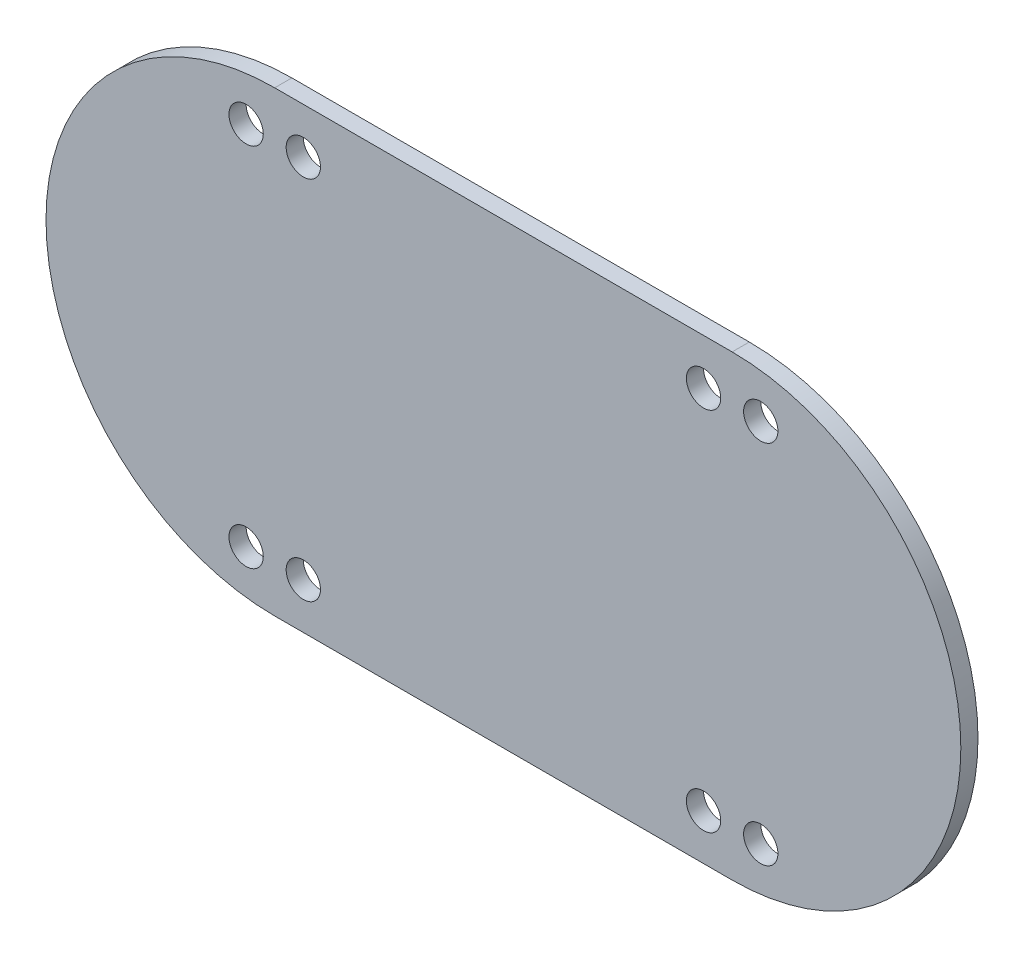
ISO-10303-21;
HEADER;
FILE_DESCRIPTION(('STEP AP214'),'2;1');
FILE_NAME('part.step','',(''),(''),'','','');
FILE_SCHEMA(('AUTOMOTIVE_DESIGN { 1 0 10303 214 1 1 1 1 }'));
ENDSEC;
DATA;
#1=APPLICATION_CONTEXT('core data for automotive mechanical design processes');
#2=APPLICATION_PROTOCOL_DEFINITION('international standard','automotive_design',2000,#1);
#3=PRODUCT_CONTEXT('',#1,'mechanical');
#4=PRODUCT('Part','Part','',(#3));
#5=PRODUCT_RELATED_PRODUCT_CATEGORY('part','',(#4));
#6=PRODUCT_DEFINITION_FORMATION('','',#4);
#7=PRODUCT_DEFINITION_CONTEXT('part definition',#1,'design');
#8=PRODUCT_DEFINITION('design','',#6,#7);
#9=PRODUCT_DEFINITION_SHAPE('','',#8);
#10=(LENGTH_UNIT() NAMED_UNIT(*) SI_UNIT(.MILLI.,.METRE.));
#11=(NAMED_UNIT(*) PLANE_ANGLE_UNIT() SI_UNIT($,.RADIAN.));
#12=(NAMED_UNIT(*) SI_UNIT($,.STERADIAN.) SOLID_ANGLE_UNIT());
#13=UNCERTAINTY_MEASURE_WITH_UNIT(LENGTH_MEASURE(1.E-05),#10,'distance_accuracy_value','');
#14=(GEOMETRIC_REPRESENTATION_CONTEXT(3) GLOBAL_UNCERTAINTY_ASSIGNED_CONTEXT((#13)) GLOBAL_UNIT_ASSIGNED_CONTEXT((#10,
#11,#12)) REPRESENTATION_CONTEXT('',''));
#15=CARTESIAN_POINT('',(0.,0.,0.));
#16=DIRECTION('',(0.,0.,1.));
#17=DIRECTION('',(1.,0.,0.));
#18=AXIS2_PLACEMENT_3D('',#15,#16,#17);
#19=CARTESIAN_POINT('',(-40.,0.219178082191764,3.));
#20=DIRECTION('',(0.,0.,1.));
#21=DIRECTION('',(1.,0.,0.));
#22=AXIS2_PLACEMENT_3D('',#19,#20,#21);
#23=PLANE('',#22);
#24=CARTESIAN_POINT('',(-35.,-31.7808219178082,3.));
#25=DIRECTION('',(0.,0.,1.));
#26=DIRECTION('',(1.,0.,0.));
#27=AXIS2_PLACEMENT_3D('',#24,#25,#26);
#28=CIRCLE('',#27,3.);
#29=CARTESIAN_POINT('',(-32.,-31.7808219178082,3.));
#30=VERTEX_POINT('',#29);
#31=EDGE_CURVE('E147',#30,#30,#28,.T.);
#32=ORIENTED_EDGE('',*,*,#31,.F.);
#33=EDGE_LOOP('',(#32));
#34=FACE_BOUND('',#33,.T.);
#35=CARTESIAN_POINT('',(35.,32.2191780821918,3.));
#36=DIRECTION('',(0.,0.,1.));
#37=DIRECTION('',(1.,0.,0.));
#38=AXIS2_PLACEMENT_3D('',#35,#36,#37);
#39=CIRCLE('',#38,3.);
#40=CARTESIAN_POINT('',(38.,32.2191780821918,3.));
#41=VERTEX_POINT('',#40);
#42=EDGE_CURVE('E135',#41,#41,#39,.T.);
#43=ORIENTED_EDGE('',*,*,#42,.F.);
#44=EDGE_LOOP('',(#43));
#45=FACE_BOUND('',#44,.T.);
#46=CARTESIAN_POINT('',(-45.,32.2191780821918,3.));
#47=DIRECTION('',(0.,0.,1.));
#48=DIRECTION('',(1.,0.,0.));
#49=AXIS2_PLACEMENT_3D('',#46,#47,#48);
#50=CIRCLE('',#49,3.);
#51=CARTESIAN_POINT('',(-42.,32.2191780821918,3.));
#52=VERTEX_POINT('',#51);
#53=EDGE_CURVE('E123',#52,#52,#50,.T.);
#54=ORIENTED_EDGE('',*,*,#53,.F.);
#55=EDGE_LOOP('',(#54));
#56=FACE_BOUND('',#55,.T.);
#57=CARTESIAN_POINT('',(45.,32.2191780821918,3.));
#58=DIRECTION('',(0.,0.,1.));
#59=DIRECTION('',(1.,0.,0.));
#60=AXIS2_PLACEMENT_3D('',#57,#58,#59);
#61=CIRCLE('',#60,3.);
#62=CARTESIAN_POINT('',(48.,32.2191780821918,3.));
#63=VERTEX_POINT('',#62);
#64=EDGE_CURVE('E102',#63,#63,#61,.T.);
#65=ORIENTED_EDGE('',*,*,#64,.F.);
#66=EDGE_LOOP('',(#65));
#67=FACE_BOUND('',#66,.T.);
#68=CARTESIAN_POINT('',(-40.,0.219178082191764,3.));
#69=DIRECTION('',(0.,0.,1.));
#70=DIRECTION('',(1.,0.,0.));
#71=AXIS2_PLACEMENT_3D('',#68,#69,#70);
#72=CIRCLE('',#71,40.);
#73=CARTESIAN_POINT('',(-40.0000000000001,40.2191780821917,3.));
#74=VERTEX_POINT('',#73);
#75=CARTESIAN_POINT('',(-40.,-39.7808219178082,3.));
#76=VERTEX_POINT('',#75);
#77=EDGE_CURVE('E87',#74,#76,#72,.T.);
#78=ORIENTED_EDGE('',*,*,#77,.T.);
#79=DIRECTION('',(1.,0.,0.));
#80=VECTOR('',#79,1.);
#81=CARTESIAN_POINT('',(40.,-39.7808219178082,3.));
#82=LINE('',#81,#80);
#83=CARTESIAN_POINT('',(40.,-39.7808219178082,3.));
#84=VERTEX_POINT('',#83);
#85=EDGE_CURVE('E82',#76,#84,#82,.T.);
#86=ORIENTED_EDGE('',*,*,#85,.T.);
#87=CARTESIAN_POINT('',(40.,0.219178082191789,3.));
#88=DIRECTION('',(0.,0.,1.));
#89=DIRECTION('',(1.,0.,0.));
#90=AXIS2_PLACEMENT_3D('',#87,#88,#89);
#91=CIRCLE('',#90,40.);
#92=CARTESIAN_POINT('',(39.9999999999999,40.2191780821918,3.));
#93=VERTEX_POINT('',#92);
#94=EDGE_CURVE('E85',#84,#93,#91,.T.);
#95=ORIENTED_EDGE('',*,*,#94,.T.);
#96=DIRECTION('',(-1.,0.,0.));
#97=VECTOR('',#96,1.);
#98=CARTESIAN_POINT('',(39.9999999999999,40.2191780821918,3.));
#99=LINE('',#98,#97);
#100=EDGE_CURVE('E52',#93,#74,#99,.T.);
#101=ORIENTED_EDGE('',*,*,#100,.T.);
#102=EDGE_LOOP('',(#78,#86,#95,#101));
#103=FACE_BOUND('',#102,.T.);
#104=CARTESIAN_POINT('',(45.,-31.7808219178082,3.));
#105=DIRECTION('',(0.,0.,1.));
#106=DIRECTION('',(1.,0.,0.));
#107=AXIS2_PLACEMENT_3D('',#104,#105,#106);
#108=CIRCLE('',#107,3.);
#109=CARTESIAN_POINT('',(48.,-31.7808219178082,3.));
#110=VERTEX_POINT('',#109);
#111=EDGE_CURVE('E117',#110,#110,#108,.T.);
#112=ORIENTED_EDGE('',*,*,#111,.F.);
#113=EDGE_LOOP('',(#112));
#114=FACE_BOUND('',#113,.T.);
#115=CARTESIAN_POINT('',(-45.,-31.7808219178082,3.));
#116=DIRECTION('',(0.,0.,1.));
#117=DIRECTION('',(1.,0.,0.));
#118=AXIS2_PLACEMENT_3D('',#115,#116,#117);
#119=CIRCLE('',#118,3.);
#120=CARTESIAN_POINT('',(-42.,-31.7808219178082,3.));
#121=VERTEX_POINT('',#120);
#122=EDGE_CURVE('E129',#121,#121,#119,.T.);
#123=ORIENTED_EDGE('',*,*,#122,.F.);
#124=EDGE_LOOP('',(#123));
#125=FACE_BOUND('',#124,.T.);
#126=CARTESIAN_POINT('',(-35.,32.2191780821918,3.));
#127=DIRECTION('',(0.,0.,1.));
#128=DIRECTION('',(1.,0.,0.));
#129=AXIS2_PLACEMENT_3D('',#126,#127,#128);
#130=CIRCLE('',#129,3.);
#131=CARTESIAN_POINT('',(-32.,32.2191780821918,3.));
#132=VERTEX_POINT('',#131);
#133=EDGE_CURVE('E141',#132,#132,#130,.T.);
#134=ORIENTED_EDGE('',*,*,#133,.F.);
#135=EDGE_LOOP('',(#134));
#136=FACE_BOUND('',#135,.T.);
#137=CARTESIAN_POINT('',(35.,-31.7808219178082,3.));
#138=DIRECTION('',(0.,0.,1.));
#139=DIRECTION('',(1.,0.,0.));
#140=AXIS2_PLACEMENT_3D('',#137,#138,#139);
#141=CIRCLE('',#140,3.);
#142=CARTESIAN_POINT('',(38.,-31.7808219178082,3.));
#143=VERTEX_POINT('',#142);
#144=EDGE_CURVE('E153',#143,#143,#141,.T.);
#145=ORIENTED_EDGE('',*,*,#144,.F.);
#146=EDGE_LOOP('',(#145));
#147=FACE_BOUND('',#146,.T.);
#148=ADVANCED_FACE('F35',(#34,#45,#56,#67,#103,#114,#125,#136,#147),#23,.T.);
#149=CARTESIAN_POINT('',(-40.,0.219178082191764,0.));
#150=DIRECTION('',(0.,0.,1.));
#151=DIRECTION('',(1.,0.,0.));
#152=AXIS2_PLACEMENT_3D('',#149,#150,#151);
#153=PLANE('',#152);
#154=CARTESIAN_POINT('',(-40.,0.219178082191764,0.));
#155=DIRECTION('',(0.,0.,1.));
#156=DIRECTION('',(1.,0.,0.));
#157=AXIS2_PLACEMENT_3D('',#154,#155,#156);
#158=CIRCLE('',#157,40.);
#159=CARTESIAN_POINT('',(-40.0000000000001,40.2191780821917,0.));
#160=VERTEX_POINT('',#159);
#161=CARTESIAN_POINT('',(-40.,-39.7808219178082,0.));
#162=VERTEX_POINT('',#161);
#163=EDGE_CURVE('E99',#160,#162,#158,.T.);
#164=ORIENTED_EDGE('',*,*,#163,.F.);
#165=DIRECTION('',(-1.,0.,0.));
#166=VECTOR('',#165,1.);
#167=CARTESIAN_POINT('',(39.9999999999999,40.2191780821918,0.));
#168=LINE('',#167,#166);
#169=CARTESIAN_POINT('',(39.9999999999999,40.2191780821918,0.));
#170=VERTEX_POINT('',#169);
#171=EDGE_CURVE('E75',#170,#160,#168,.T.);
#172=ORIENTED_EDGE('',*,*,#171,.F.);
#173=CARTESIAN_POINT('',(40.,0.219178082191789,0.));
#174=DIRECTION('',(0.,0.,1.));
#175=DIRECTION('',(1.,0.,0.));
#176=AXIS2_PLACEMENT_3D('',#173,#174,#175);
#177=CIRCLE('',#176,40.);
#178=CARTESIAN_POINT('',(40.,-39.7808219178082,0.));
#179=VERTEX_POINT('',#178);
#180=EDGE_CURVE('E69',#179,#170,#177,.T.);
#181=ORIENTED_EDGE('',*,*,#180,.F.);
#182=DIRECTION('',(1.,0.,0.));
#183=VECTOR('',#182,1.);
#184=CARTESIAN_POINT('',(40.,-39.7808219178082,0.));
#185=LINE('',#184,#183);
#186=EDGE_CURVE('E91',#162,#179,#185,.T.);
#187=ORIENTED_EDGE('',*,*,#186,.F.);
#188=EDGE_LOOP('',(#164,#172,#181,#187));
#189=FACE_BOUND('',#188,.T.);
#190=CARTESIAN_POINT('',(45.,32.2191780821918,0.));
#191=DIRECTION('',(0.,0.,1.));
#192=DIRECTION('',(1.,0.,0.));
#193=AXIS2_PLACEMENT_3D('',#190,#191,#192);
#194=CIRCLE('',#193,3.);
#195=CARTESIAN_POINT('',(48.,32.2191780821918,0.));
#196=VERTEX_POINT('',#195);
#197=EDGE_CURVE('E114',#196,#196,#194,.T.);
#198=ORIENTED_EDGE('',*,*,#197,.T.);
#199=EDGE_LOOP('',(#198));
#200=FACE_BOUND('',#199,.T.);
#201=CARTESIAN_POINT('',(45.,-31.7808219178082,0.));
#202=DIRECTION('',(0.,0.,1.));
#203=DIRECTION('',(1.,0.,0.));
#204=AXIS2_PLACEMENT_3D('',#201,#202,#203);
#205=CIRCLE('',#204,3.);
#206=CARTESIAN_POINT('',(48.,-31.7808219178082,0.));
#207=VERTEX_POINT('',#206);
#208=EDGE_CURVE('E120',#207,#207,#205,.T.);
#209=ORIENTED_EDGE('',*,*,#208,.T.);
#210=EDGE_LOOP('',(#209));
#211=FACE_BOUND('',#210,.T.);
#212=CARTESIAN_POINT('',(-45.,32.2191780821918,0.));
#213=DIRECTION('',(0.,0.,1.));
#214=DIRECTION('',(1.,0.,0.));
#215=AXIS2_PLACEMENT_3D('',#212,#213,#214);
#216=CIRCLE('',#215,3.);
#217=CARTESIAN_POINT('',(-42.,32.2191780821918,0.));
#218=VERTEX_POINT('',#217);
#219=EDGE_CURVE('E126',#218,#218,#216,.T.);
#220=ORIENTED_EDGE('',*,*,#219,.T.);
#221=EDGE_LOOP('',(#220));
#222=FACE_BOUND('',#221,.T.);
#223=CARTESIAN_POINT('',(-45.,-31.7808219178082,0.));
#224=DIRECTION('',(0.,0.,1.));
#225=DIRECTION('',(1.,0.,0.));
#226=AXIS2_PLACEMENT_3D('',#223,#224,#225);
#227=CIRCLE('',#226,3.);
#228=CARTESIAN_POINT('',(-42.,-31.7808219178082,0.));
#229=VERTEX_POINT('',#228);
#230=EDGE_CURVE('E132',#229,#229,#227,.T.);
#231=ORIENTED_EDGE('',*,*,#230,.T.);
#232=EDGE_LOOP('',(#231));
#233=FACE_BOUND('',#232,.T.);
#234=CARTESIAN_POINT('',(35.,32.2191780821918,0.));
#235=DIRECTION('',(0.,0.,1.));
#236=DIRECTION('',(1.,0.,0.));
#237=AXIS2_PLACEMENT_3D('',#234,#235,#236);
#238=CIRCLE('',#237,3.);
#239=CARTESIAN_POINT('',(38.,32.2191780821918,0.));
#240=VERTEX_POINT('',#239);
#241=EDGE_CURVE('E138',#240,#240,#238,.T.);
#242=ORIENTED_EDGE('',*,*,#241,.T.);
#243=EDGE_LOOP('',(#242));
#244=FACE_BOUND('',#243,.T.);
#245=CARTESIAN_POINT('',(-35.,32.2191780821918,0.));
#246=DIRECTION('',(0.,0.,1.));
#247=DIRECTION('',(1.,0.,0.));
#248=AXIS2_PLACEMENT_3D('',#245,#246,#247);
#249=CIRCLE('',#248,3.);
#250=CARTESIAN_POINT('',(-32.,32.2191780821918,0.));
#251=VERTEX_POINT('',#250);
#252=EDGE_CURVE('E144',#251,#251,#249,.T.);
#253=ORIENTED_EDGE('',*,*,#252,.T.);
#254=EDGE_LOOP('',(#253));
#255=FACE_BOUND('',#254,.T.);
#256=CARTESIAN_POINT('',(-35.,-31.7808219178082,0.));
#257=DIRECTION('',(0.,0.,1.));
#258=DIRECTION('',(1.,0.,0.));
#259=AXIS2_PLACEMENT_3D('',#256,#257,#258);
#260=CIRCLE('',#259,3.);
#261=CARTESIAN_POINT('',(-32.,-31.7808219178082,0.));
#262=VERTEX_POINT('',#261);
#263=EDGE_CURVE('E150',#262,#262,#260,.T.);
#264=ORIENTED_EDGE('',*,*,#263,.T.);
#265=EDGE_LOOP('',(#264));
#266=FACE_BOUND('',#265,.T.);
#267=CARTESIAN_POINT('',(35.,-31.7808219178082,0.));
#268=DIRECTION('',(0.,0.,1.));
#269=DIRECTION('',(1.,0.,0.));
#270=AXIS2_PLACEMENT_3D('',#267,#268,#269);
#271=CIRCLE('',#270,3.);
#272=CARTESIAN_POINT('',(38.,-31.7808219178082,0.));
#273=VERTEX_POINT('',#272);
#274=EDGE_CURVE('E156',#273,#273,#271,.T.);
#275=ORIENTED_EDGE('',*,*,#274,.T.);
#276=EDGE_LOOP('',(#275));
#277=FACE_BOUND('',#276,.T.);
#278=ADVANCED_FACE('F110',(#189,#200,#211,#222,#233,#244,#255,#266,#277),#153,.F.);
#279=CARTESIAN_POINT('',(-40.,0.219178082191764,3.));
#280=DIRECTION('',(0.,0.,-1.));
#281=DIRECTION('',(-1.,0.,0.));
#282=AXIS2_PLACEMENT_3D('',#279,#280,#281);
#283=CYLINDRICAL_SURFACE('',#282,40.);
#284=ORIENTED_EDGE('',*,*,#163,.T.);
#285=DIRECTION('',(0.,0.,-1.));
#286=VECTOR('',#285,1.);
#287=CARTESIAN_POINT('',(-40.,-39.7808219178082,3.));
#288=LINE('',#287,#286);
#289=EDGE_CURVE('E11',#76,#162,#288,.T.);
#290=ORIENTED_EDGE('',*,*,#289,.F.);
#291=ORIENTED_EDGE('',*,*,#77,.F.);
#292=DIRECTION('',(0.,0.,-1.));
#293=VECTOR('',#292,1.);
#294=CARTESIAN_POINT('',(-40.0000000000001,40.2191780821917,3.));
#295=LINE('',#294,#293);
#296=EDGE_CURVE('E95',#74,#160,#295,.T.);
#297=ORIENTED_EDGE('',*,*,#296,.T.);
#298=EDGE_LOOP('',(#284,#290,#291,#297));
#299=FACE_BOUND('',#298,.T.);
#300=ADVANCED_FACE('F37',(#299),#283,.T.);
#301=CARTESIAN_POINT('',(40.,-39.7808219178082,3.));
#302=DIRECTION('',(0.,1.,0.));
#303=DIRECTION('',(-1.,0.,0.));
#304=AXIS2_PLACEMENT_3D('',#301,#302,#303);
#305=PLANE('',#304);
#306=ORIENTED_EDGE('',*,*,#186,.T.);
#307=DIRECTION('',(0.,0.,-1.));
#308=VECTOR('',#307,1.);
#309=CARTESIAN_POINT('',(40.,-39.7808219178082,3.));
#310=LINE('',#309,#308);
#311=EDGE_CURVE('E44',#84,#179,#310,.T.);
#312=ORIENTED_EDGE('',*,*,#311,.F.);
#313=ORIENTED_EDGE('',*,*,#85,.F.);
#314=ORIENTED_EDGE('',*,*,#289,.T.);
#315=EDGE_LOOP('',(#306,#312,#313,#314));
#316=FACE_BOUND('',#315,.T.);
#317=ADVANCED_FACE('F90',(#316),#305,.F.);
#318=CARTESIAN_POINT('',(40.,0.219178082191789,3.));
#319=DIRECTION('',(0.,0.,-1.));
#320=DIRECTION('',(-1.,0.,0.));
#321=AXIS2_PLACEMENT_3D('',#318,#319,#320);
#322=CYLINDRICAL_SURFACE('',#321,40.);
#323=ORIENTED_EDGE('',*,*,#180,.T.);
#324=DIRECTION('',(0.,0.,-1.));
#325=VECTOR('',#324,1.);
#326=CARTESIAN_POINT('',(39.9999999999999,40.2191780821918,3.));
#327=LINE('',#326,#325);
#328=EDGE_CURVE('E92',#93,#170,#327,.T.);
#329=ORIENTED_EDGE('',*,*,#328,.F.);
#330=ORIENTED_EDGE('',*,*,#94,.F.);
#331=ORIENTED_EDGE('',*,*,#311,.T.);
#332=EDGE_LOOP('',(#323,#329,#330,#331));
#333=FACE_BOUND('',#332,.T.);
#334=ADVANCED_FACE('F93',(#333),#322,.T.);
#335=CARTESIAN_POINT('',(39.9999999999999,40.2191780821918,3.));
#336=DIRECTION('',(0.,-1.,0.));
#337=DIRECTION('',(1.,0.,0.));
#338=AXIS2_PLACEMENT_3D('',#335,#336,#337);
#339=PLANE('',#338);
#340=ORIENTED_EDGE('',*,*,#171,.T.);
#341=ORIENTED_EDGE('',*,*,#296,.F.);
#342=ORIENTED_EDGE('',*,*,#100,.F.);
#343=ORIENTED_EDGE('',*,*,#328,.T.);
#344=EDGE_LOOP('',(#340,#341,#342,#343));
#345=FACE_BOUND('',#344,.T.);
#346=ADVANCED_FACE('F107',(#345),#339,.F.);
#347=CARTESIAN_POINT('',(45.,32.2191780821918,3.));
#348=DIRECTION('',(0.,0.,-1.));
#349=DIRECTION('',(-1.,0.,0.));
#350=AXIS2_PLACEMENT_3D('',#347,#348,#349);
#351=CYLINDRICAL_SURFACE('',#350,3.);
#352=ORIENTED_EDGE('',*,*,#64,.T.);
#353=EDGE_LOOP('',(#352));
#354=FACE_BOUND('',#353,.T.);
#355=ORIENTED_EDGE('',*,*,#197,.F.);
#356=EDGE_LOOP('',(#355));
#357=FACE_BOUND('',#356,.T.);
#358=ADVANCED_FACE('F175',(#354,#357),#351,.F.);
#359=CARTESIAN_POINT('',(45.,-31.7808219178082,3.));
#360=DIRECTION('',(0.,0.,-1.));
#361=DIRECTION('',(-1.,0.,0.));
#362=AXIS2_PLACEMENT_3D('',#359,#360,#361);
#363=CYLINDRICAL_SURFACE('',#362,3.);
#364=ORIENTED_EDGE('',*,*,#111,.T.);
#365=EDGE_LOOP('',(#364));
#366=FACE_BOUND('',#365,.T.);
#367=ORIENTED_EDGE('',*,*,#208,.F.);
#368=EDGE_LOOP('',(#367));
#369=FACE_BOUND('',#368,.T.);
#370=ADVANCED_FACE('F223',(#366,#369),#363,.F.);
#371=CARTESIAN_POINT('',(-45.,32.2191780821918,3.));
#372=DIRECTION('',(0.,0.,-1.));
#373=DIRECTION('',(-1.,0.,0.));
#374=AXIS2_PLACEMENT_3D('',#371,#372,#373);
#375=CYLINDRICAL_SURFACE('',#374,3.);
#376=ORIENTED_EDGE('',*,*,#53,.T.);
#377=EDGE_LOOP('',(#376));
#378=FACE_BOUND('',#377,.T.);
#379=ORIENTED_EDGE('',*,*,#219,.F.);
#380=EDGE_LOOP('',(#379));
#381=FACE_BOUND('',#380,.T.);
#382=ADVANCED_FACE('F231',(#378,#381),#375,.F.);
#383=CARTESIAN_POINT('',(-45.,-31.7808219178082,3.));
#384=DIRECTION('',(0.,0.,-1.));
#385=DIRECTION('',(-1.,0.,0.));
#386=AXIS2_PLACEMENT_3D('',#383,#384,#385);
#387=CYLINDRICAL_SURFACE('',#386,3.);
#388=ORIENTED_EDGE('',*,*,#122,.T.);
#389=EDGE_LOOP('',(#388));
#390=FACE_BOUND('',#389,.T.);
#391=ORIENTED_EDGE('',*,*,#230,.F.);
#392=EDGE_LOOP('',(#391));
#393=FACE_BOUND('',#392,.T.);
#394=ADVANCED_FACE('F239',(#390,#393),#387,.F.);
#395=CARTESIAN_POINT('',(35.,32.2191780821918,3.));
#396=DIRECTION('',(0.,0.,-1.));
#397=DIRECTION('',(-1.,0.,0.));
#398=AXIS2_PLACEMENT_3D('',#395,#396,#397);
#399=CYLINDRICAL_SURFACE('',#398,3.);
#400=ORIENTED_EDGE('',*,*,#42,.T.);
#401=EDGE_LOOP('',(#400));
#402=FACE_BOUND('',#401,.T.);
#403=ORIENTED_EDGE('',*,*,#241,.F.);
#404=EDGE_LOOP('',(#403));
#405=FACE_BOUND('',#404,.T.);
#406=ADVANCED_FACE('F248',(#402,#405),#399,.F.);
#407=CARTESIAN_POINT('',(-35.,32.2191780821918,3.));
#408=DIRECTION('',(0.,0.,-1.));
#409=DIRECTION('',(-1.,0.,0.));
#410=AXIS2_PLACEMENT_3D('',#407,#408,#409);
#411=CYLINDRICAL_SURFACE('',#410,3.);
#412=ORIENTED_EDGE('',*,*,#133,.T.);
#413=EDGE_LOOP('',(#412));
#414=FACE_BOUND('',#413,.T.);
#415=ORIENTED_EDGE('',*,*,#252,.F.);
#416=EDGE_LOOP('',(#415));
#417=FACE_BOUND('',#416,.T.);
#418=ADVANCED_FACE('F257',(#414,#417),#411,.F.);
#419=CARTESIAN_POINT('',(-35.,-31.7808219178082,3.));
#420=DIRECTION('',(0.,0.,-1.));
#421=DIRECTION('',(-1.,0.,0.));
#422=AXIS2_PLACEMENT_3D('',#419,#420,#421);
#423=CYLINDRICAL_SURFACE('',#422,3.);
#424=ORIENTED_EDGE('',*,*,#31,.T.);
#425=EDGE_LOOP('',(#424));
#426=FACE_BOUND('',#425,.T.);
#427=ORIENTED_EDGE('',*,*,#263,.F.);
#428=EDGE_LOOP('',(#427));
#429=FACE_BOUND('',#428,.T.);
#430=ADVANCED_FACE('F266',(#426,#429),#423,.F.);
#431=CARTESIAN_POINT('',(35.,-31.7808219178082,3.));
#432=DIRECTION('',(0.,0.,-1.));
#433=DIRECTION('',(-1.,0.,0.));
#434=AXIS2_PLACEMENT_3D('',#431,#432,#433);
#435=CYLINDRICAL_SURFACE('',#434,3.);
#436=ORIENTED_EDGE('',*,*,#144,.T.);
#437=EDGE_LOOP('',(#436));
#438=FACE_BOUND('',#437,.T.);
#439=ORIENTED_EDGE('',*,*,#274,.F.);
#440=EDGE_LOOP('',(#439));
#441=FACE_BOUND('',#440,.T.);
#442=ADVANCED_FACE('F162',(#438,#441),#435,.F.);
#443=CLOSED_SHELL('',(#148,#278,#300,#317,#334,#346,#358,#370,#382,#394,#406,#418,#430,#442));
#444=MANIFOLD_SOLID_BREP('B2',#443);
#445=ADVANCED_BREP_SHAPE_REPRESENTATION('',(#18,#444),#14);
#446=SHAPE_DEFINITION_REPRESENTATION(#9,#445);
ENDSEC;
END-ISO-10303-21;
